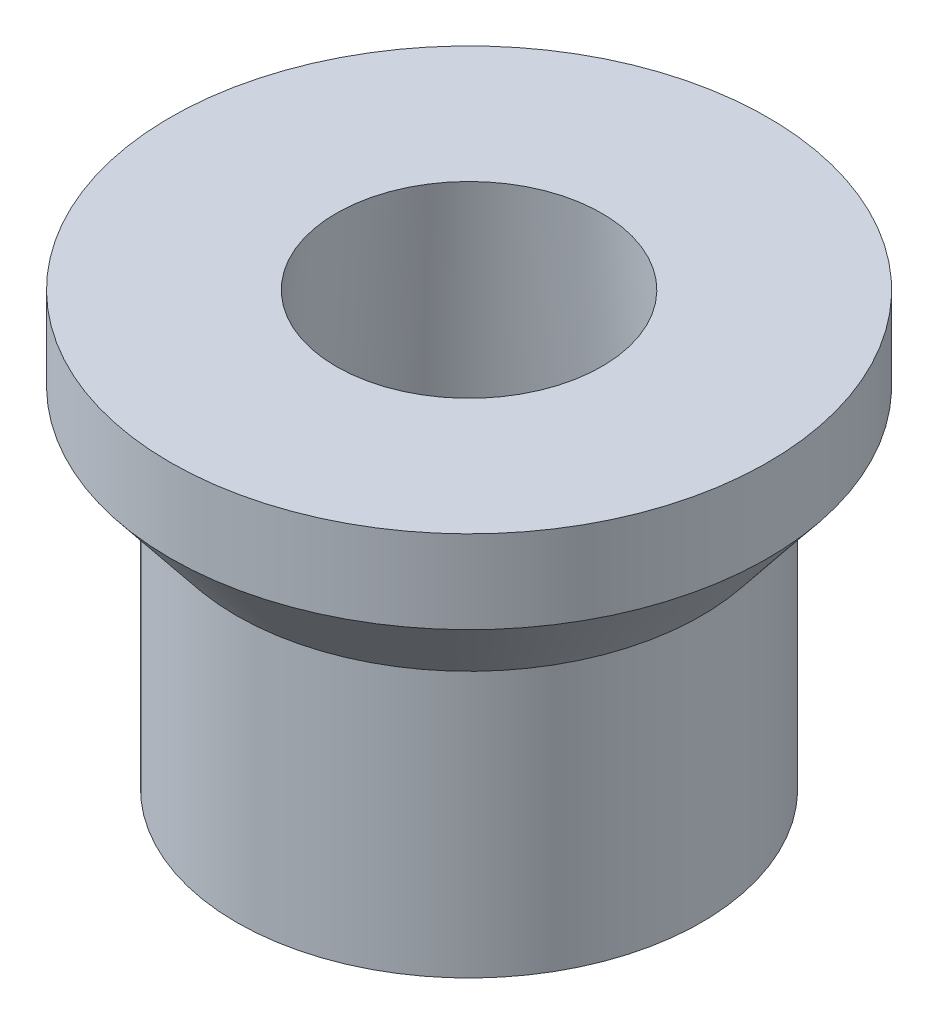
ISO-10303-21;
HEADER;
FILE_DESCRIPTION(('STEP AP214'),'2;1');
FILE_NAME('part.step','',(''),(''),'','','');
FILE_SCHEMA(('AUTOMOTIVE_DESIGN { 1 0 10303 214 1 1 1 1 }'));
ENDSEC;
DATA;
#1=APPLICATION_CONTEXT('core data for automotive mechanical design processes');
#2=APPLICATION_PROTOCOL_DEFINITION('international standard','automotive_design',2000,#1);
#3=PRODUCT_CONTEXT('',#1,'mechanical');
#4=PRODUCT('Part','Part','',(#3));
#5=PRODUCT_RELATED_PRODUCT_CATEGORY('part','',(#4));
#6=PRODUCT_DEFINITION_FORMATION('','',#4);
#7=PRODUCT_DEFINITION_CONTEXT('part definition',#1,'design');
#8=PRODUCT_DEFINITION('design','',#6,#7);
#9=PRODUCT_DEFINITION_SHAPE('','',#8);
#10=(LENGTH_UNIT() NAMED_UNIT(*) SI_UNIT(.MILLI.,.METRE.));
#11=(NAMED_UNIT(*) PLANE_ANGLE_UNIT() SI_UNIT($,.RADIAN.));
#12=(NAMED_UNIT(*) SI_UNIT($,.STERADIAN.) SOLID_ANGLE_UNIT());
#13=UNCERTAINTY_MEASURE_WITH_UNIT(LENGTH_MEASURE(1.E-05),#10,'distance_accuracy_value','');
#14=(GEOMETRIC_REPRESENTATION_CONTEXT(3) GLOBAL_UNCERTAINTY_ASSIGNED_CONTEXT((#13)) GLOBAL_UNIT_ASSIGNED_CONTEXT((#10,
#11,#12)) REPRESENTATION_CONTEXT('',''));
#15=CARTESIAN_POINT('',(0.,0.,0.));
#16=DIRECTION('',(0.,0.,1.));
#17=DIRECTION('',(1.,0.,0.));
#18=AXIS2_PLACEMENT_3D('',#15,#16,#17);
#19=CARTESIAN_POINT('',(0.,13.0001,0.));
#20=DIRECTION('',(0.,-1.,0.));
#21=DIRECTION('',(0.,0.,-1.));
#22=AXIS2_PLACEMENT_3D('',#19,#20,#21);
#23=PLANE('',#22);
#24=CARTESIAN_POINT('',(0.,13.0001,0.));
#25=DIRECTION('',(0.,1.,0.));
#26=DIRECTION('',(0.,0.,1.));
#27=AXIS2_PLACEMENT_3D('',#24,#25,#26);
#28=CIRCLE('',#27,3.99989201227069);
#29=CARTESIAN_POINT('',(0.,13.0001,3.99989201227069));
#30=VERTEX_POINT('',#29);
#31=EDGE_CURVE('E72',#30,#30,#28,.T.);
#32=ORIENTED_EDGE('',*,*,#31,.F.);
#33=EDGE_LOOP('',(#32));
#34=FACE_BOUND('',#33,.T.);
#35=CARTESIAN_POINT('',(0.,13.0001,0.));
#36=DIRECTION('',(0.,1.,0.));
#37=DIRECTION('',(0.,0.,1.));
#38=AXIS2_PLACEMENT_3D('',#35,#36,#37);
#39=CIRCLE('',#38,9.0001);
#40=CARTESIAN_POINT('',(0.,13.0001,9.0001));
#41=VERTEX_POINT('',#40);
#42=EDGE_CURVE('E10',#41,#41,#39,.T.);
#43=ORIENTED_EDGE('',*,*,#42,.T.);
#44=EDGE_LOOP('',(#43));
#45=FACE_BOUND('',#44,.T.);
#46=ADVANCED_FACE('F42',(#34,#45),#23,.F.);
#47=CARTESIAN_POINT('',(0.,0.,0.));
#48=DIRECTION('',(0.,1.,0.));
#49=DIRECTION('',(0.,0.,1.));
#50=AXIS2_PLACEMENT_3D('',#47,#48,#49);
#51=CYLINDRICAL_SURFACE('',#50,9.0001);
#52=ORIENTED_EDGE('',*,*,#42,.F.);
#53=EDGE_LOOP('',(#52));
#54=FACE_BOUND('',#53,.T.);
#55=CARTESIAN_POINT('',(0.,10.4999649218941,0.));
#56=DIRECTION('',(0.,1.,0.));
#57=DIRECTION('',(0.,0.,1.));
#58=AXIS2_PLACEMENT_3D('',#55,#56,#57);
#59=CIRCLE('',#58,9.0001);
#60=CARTESIAN_POINT('',(0.,10.4999649218941,9.0001));
#61=VERTEX_POINT('',#60);
#62=EDGE_CURVE('E51',#61,#61,#59,.T.);
#63=ORIENTED_EDGE('',*,*,#62,.T.);
#64=EDGE_LOOP('',(#63));
#65=FACE_BOUND('',#64,.T.);
#66=ADVANCED_FACE('F143',(#54,#65),#51,.T.);
#67=CARTESIAN_POINT('',(0.,7.99996492189406,0.));
#68=DIRECTION('',(0.,1.,0.));
#69=DIRECTION('',(0.,0.,1.));
#70=AXIS2_PLACEMENT_3D('',#67,#68,#69);
#71=CONICAL_SURFACE('',#70,7.0001,0.674740942223553);
#72=ORIENTED_EDGE('',*,*,#62,.F.);
#73=EDGE_LOOP('',(#72));
#74=FACE_BOUND('',#73,.T.);
#75=CARTESIAN_POINT('',(0.,7.99996492189406,0.));
#76=DIRECTION('',(0.,1.,0.));
#77=DIRECTION('',(0.,0.,1.));
#78=AXIS2_PLACEMENT_3D('',#75,#76,#77);
#79=CIRCLE('',#78,7.0001);
#80=CARTESIAN_POINT('',(0.,7.99996492189406,7.0001));
#81=VERTEX_POINT('',#80);
#82=EDGE_CURVE('E57',#81,#81,#79,.T.);
#83=ORIENTED_EDGE('',*,*,#82,.T.);
#84=EDGE_LOOP('',(#83));
#85=FACE_BOUND('',#84,.T.);
#86=ADVANCED_FACE('F139',(#74,#85),#71,.T.);
#87=CARTESIAN_POINT('',(0.,0.,0.));
#88=DIRECTION('',(0.,1.,0.));
#89=DIRECTION('',(0.,0.,1.));
#90=AXIS2_PLACEMENT_3D('',#87,#88,#89);
#91=CYLINDRICAL_SURFACE('',#90,7.0001);
#92=ORIENTED_EDGE('',*,*,#82,.F.);
#93=EDGE_LOOP('',(#92));
#94=FACE_BOUND('',#93,.T.);
#95=CARTESIAN_POINT('',(0.,-0.0001,0.));
#96=DIRECTION('',(0.,1.,0.));
#97=DIRECTION('',(0.,0.,1.));
#98=AXIS2_PLACEMENT_3D('',#95,#96,#97);
#99=CIRCLE('',#98,7.0001);
#100=CARTESIAN_POINT('',(0.,-0.0001,7.0001));
#101=VERTEX_POINT('',#100);
#102=EDGE_CURVE('E62',#101,#101,#99,.T.);
#103=ORIENTED_EDGE('',*,*,#102,.T.);
#104=EDGE_LOOP('',(#103));
#105=FACE_BOUND('',#104,.T.);
#106=ADVANCED_FACE('F131',(#94,#105),#91,.T.);
#107=CARTESIAN_POINT('',(0.,-0.0001,0.));
#108=DIRECTION('',(0.,1.,0.));
#109=DIRECTION('',(0.,0.,1.));
#110=AXIS2_PLACEMENT_3D('',#107,#108,#109);
#111=PLANE('',#110);
#112=ORIENTED_EDGE('',*,*,#102,.F.);
#113=EDGE_LOOP('',(#112));
#114=FACE_BOUND('',#113,.T.);
#115=CARTESIAN_POINT('',(0.,-0.0001,0.));
#116=DIRECTION('',(0.,1.,0.));
#117=DIRECTION('',(0.,0.,1.));
#118=AXIS2_PLACEMENT_3D('',#115,#116,#117);
#119=CIRCLE('',#118,4.99990739688607);
#120=CARTESIAN_POINT('',(0.,-0.0001,4.99990739688607));
#121=VERTEX_POINT('',#120);
#122=EDGE_CURVE('E70',#121,#121,#119,.T.);
#123=ORIENTED_EDGE('',*,*,#122,.T.);
#124=EDGE_LOOP('',(#123));
#125=FACE_BOUND('',#124,.T.);
#126=ADVANCED_FACE('F128',(#114,#125),#111,.F.);
#127=CARTESIAN_POINT('',(0.,13.0001,0.));
#128=DIRECTION('',(0.,-1.,0.));
#129=DIRECTION('',(0.,0.,-1.));
#130=AXIS2_PLACEMENT_3D('',#127,#128,#129);
#131=CONICAL_SURFACE('',#130,3.99989201227069,0.0767718912697781);
#132=ORIENTED_EDGE('',*,*,#122,.F.);
#133=EDGE_LOOP('',(#132));
#134=FACE_BOUND('',#133,.T.);
#135=ORIENTED_EDGE('',*,*,#31,.T.);
#136=EDGE_LOOP('',(#135));
#137=FACE_BOUND('',#136,.T.);
#138=ADVANCED_FACE('F126',(#134,#137),#131,.F.);
#139=CLOSED_SHELL('',(#46,#66,#86,#106,#126,#138));
#140=CARTESIAN_POINT('',(0.,13.,0.));
#141=DIRECTION('',(0.,-1.,0.));
#142=DIRECTION('',(0.,0.,-1.));
#143=AXIS2_PLACEMENT_3D('',#140,#141,#142);
#144=PLANE('',#143);
#145=CARTESIAN_POINT('',(0.,13.,0.));
#146=DIRECTION('',(0.,1.,0.));
#147=DIRECTION('',(0.,0.,1.));
#148=AXIS2_PLACEMENT_3D('',#145,#146,#147);
#149=CIRCLE('',#148,4.);
#150=CARTESIAN_POINT('',(0.,13.,4.));
#151=VERTEX_POINT('',#150);
#152=EDGE_CURVE('E92',#151,#151,#149,.T.);
#153=ORIENTED_EDGE('',*,*,#152,.T.);
#154=EDGE_LOOP('',(#153));
#155=FACE_BOUND('',#154,.T.);
#156=CARTESIAN_POINT('',(0.,13.,0.));
#157=DIRECTION('',(0.,1.,0.));
#158=DIRECTION('',(0.,0.,1.));
#159=AXIS2_PLACEMENT_3D('',#156,#157,#158);
#160=CIRCLE('',#159,9.);
#161=CARTESIAN_POINT('',(0.,13.,9.));
#162=VERTEX_POINT('',#161);
#163=EDGE_CURVE('E73',#162,#162,#160,.T.);
#164=ORIENTED_EDGE('',*,*,#163,.F.);
#165=EDGE_LOOP('',(#164));
#166=FACE_BOUND('',#165,.T.);
#167=ADVANCED_FACE('F99',(#155,#166),#144,.T.);
#168=CARTESIAN_POINT('',(0.,0.,0.));
#169=DIRECTION('',(0.,1.,0.));
#170=DIRECTION('',(0.,0.,1.));
#171=AXIS2_PLACEMENT_3D('',#168,#169,#170);
#172=CYLINDRICAL_SURFACE('',#171,9.);
#173=ORIENTED_EDGE('',*,*,#163,.T.);
#174=EDGE_LOOP('',(#173));
#175=FACE_BOUND('',#174,.T.);
#176=CARTESIAN_POINT('',(0.,10.5,0.));
#177=DIRECTION('',(0.,1.,0.));
#178=DIRECTION('',(0.,0.,1.));
#179=AXIS2_PLACEMENT_3D('',#176,#177,#178);
#180=CIRCLE('',#179,9.);
#181=CARTESIAN_POINT('',(0.,10.5,9.));
#182=VERTEX_POINT('',#181);
#183=EDGE_CURVE('E76',#182,#182,#180,.T.);
#184=ORIENTED_EDGE('',*,*,#183,.F.);
#185=EDGE_LOOP('',(#184));
#186=FACE_BOUND('',#185,.T.);
#187=ADVANCED_FACE('F120',(#175,#186),#172,.F.);
#188=CARTESIAN_POINT('',(0.,8.,0.));
#189=DIRECTION('',(0.,1.,0.));
#190=DIRECTION('',(0.,0.,1.));
#191=AXIS2_PLACEMENT_3D('',#188,#189,#190);
#192=CONICAL_SURFACE('',#191,7.,0.674740942223553);
#193=ORIENTED_EDGE('',*,*,#183,.T.);
#194=EDGE_LOOP('',(#193));
#195=FACE_BOUND('',#194,.T.);
#196=CARTESIAN_POINT('',(0.,8.,0.));
#197=DIRECTION('',(0.,1.,0.));
#198=DIRECTION('',(0.,0.,1.));
#199=AXIS2_PLACEMENT_3D('',#196,#197,#198);
#200=CIRCLE('',#199,7.);
#201=CARTESIAN_POINT('',(0.,8.,7.));
#202=VERTEX_POINT('',#201);
#203=EDGE_CURVE('E84',#202,#202,#200,.T.);
#204=ORIENTED_EDGE('',*,*,#203,.F.);
#205=EDGE_LOOP('',(#204));
#206=FACE_BOUND('',#205,.T.);
#207=ADVANCED_FACE('F124',(#195,#206),#192,.F.);
#208=CARTESIAN_POINT('',(0.,0.,0.));
#209=DIRECTION('',(0.,1.,0.));
#210=DIRECTION('',(0.,0.,1.));
#211=AXIS2_PLACEMENT_3D('',#208,#209,#210);
#212=CYLINDRICAL_SURFACE('',#211,7.);
#213=ORIENTED_EDGE('',*,*,#203,.T.);
#214=EDGE_LOOP('',(#213));
#215=FACE_BOUND('',#214,.T.);
#216=CARTESIAN_POINT('',(0.,0.,0.));
#217=DIRECTION('',(0.,1.,0.));
#218=DIRECTION('',(0.,0.,1.));
#219=AXIS2_PLACEMENT_3D('',#216,#217,#218);
#220=CIRCLE('',#219,7.);
#221=CARTESIAN_POINT('',(0.,0.,7.));
#222=VERTEX_POINT('',#221);
#223=EDGE_CURVE('E87',#222,#222,#220,.T.);
#224=ORIENTED_EDGE('',*,*,#223,.F.);
#225=EDGE_LOOP('',(#224));
#226=FACE_BOUND('',#225,.T.);
#227=ADVANCED_FACE('F115',(#215,#226),#212,.F.);
#228=CARTESIAN_POINT('',(0.,0.,0.));
#229=DIRECTION('',(0.,1.,0.));
#230=DIRECTION('',(0.,0.,1.));
#231=AXIS2_PLACEMENT_3D('',#228,#229,#230);
#232=PLANE('',#231);
#233=ORIENTED_EDGE('',*,*,#223,.T.);
#234=EDGE_LOOP('',(#233));
#235=FACE_BOUND('',#234,.T.);
#236=CARTESIAN_POINT('',(0.,0.,0.));
#237=DIRECTION('',(0.,1.,0.));
#238=DIRECTION('',(0.,0.,1.));
#239=AXIS2_PLACEMENT_3D('',#236,#237,#238);
#240=CIRCLE('',#239,5.);
#241=CARTESIAN_POINT('',(0.,0.,5.));
#242=VERTEX_POINT('',#241);
#243=EDGE_CURVE('E93',#242,#242,#240,.T.);
#244=ORIENTED_EDGE('',*,*,#243,.F.);
#245=EDGE_LOOP('',(#244));
#246=FACE_BOUND('',#245,.T.);
#247=ADVANCED_FACE('F104',(#235,#246),#232,.T.);
#248=CARTESIAN_POINT('',(0.,13.,0.));
#249=DIRECTION('',(0.,-1.,0.));
#250=DIRECTION('',(0.,0.,-1.));
#251=AXIS2_PLACEMENT_3D('',#248,#249,#250);
#252=CONICAL_SURFACE('',#251,4.,0.0767718912697782);
#253=ORIENTED_EDGE('',*,*,#243,.T.);
#254=EDGE_LOOP('',(#253));
#255=FACE_BOUND('',#254,.T.);
#256=ORIENTED_EDGE('',*,*,#152,.F.);
#257=EDGE_LOOP('',(#256));
#258=FACE_BOUND('',#257,.T.);
#259=ADVANCED_FACE('F103',(#255,#258),#252,.T.);
#260=CLOSED_SHELL('',(#167,#187,#207,#227,#247,#259));
#261=ORIENTED_CLOSED_SHELL('',*,#260,.T.);
#262=BREP_WITH_VOIDS('B2',#139,(#261));
#263=ADVANCED_BREP_SHAPE_REPRESENTATION('',(#18,#262),#14);
#264=SHAPE_DEFINITION_REPRESENTATION(#9,#263);
ENDSEC;
END-ISO-10303-21;
